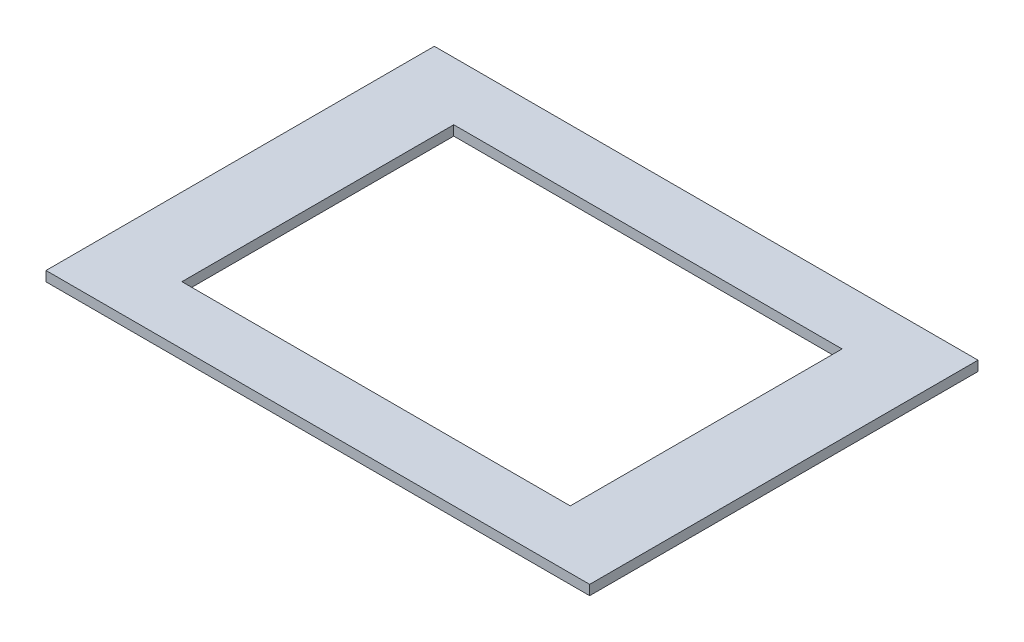
ISO-10303-21;
HEADER;
FILE_DESCRIPTION(('STEP AP214'),'2;1');
FILE_NAME('part.step','',(''),(''),'','','');
FILE_SCHEMA(('AUTOMOTIVE_DESIGN { 1 0 10303 214 1 1 1 1 }'));
ENDSEC;
DATA;
#1=APPLICATION_CONTEXT('core data for automotive mechanical design processes');
#2=APPLICATION_PROTOCOL_DEFINITION('international standard','automotive_design',2000,#1);
#3=PRODUCT_CONTEXT('',#1,'mechanical');
#4=PRODUCT('Part','Part','',(#3));
#5=PRODUCT_RELATED_PRODUCT_CATEGORY('part','',(#4));
#6=PRODUCT_DEFINITION_FORMATION('','',#4);
#7=PRODUCT_DEFINITION_CONTEXT('part definition',#1,'design');
#8=PRODUCT_DEFINITION('design','',#6,#7);
#9=PRODUCT_DEFINITION_SHAPE('','',#8);
#10=(LENGTH_UNIT() NAMED_UNIT(*) SI_UNIT(.MILLI.,.METRE.));
#11=(NAMED_UNIT(*) PLANE_ANGLE_UNIT() SI_UNIT($,.RADIAN.));
#12=(NAMED_UNIT(*) SI_UNIT($,.STERADIAN.) SOLID_ANGLE_UNIT());
#13=UNCERTAINTY_MEASURE_WITH_UNIT(LENGTH_MEASURE(1.E-05),#10,'distance_accuracy_value','');
#14=(GEOMETRIC_REPRESENTATION_CONTEXT(3) GLOBAL_UNCERTAINTY_ASSIGNED_CONTEXT((#13)) GLOBAL_UNIT_ASSIGNED_CONTEXT((#10,
#11,#12)) REPRESENTATION_CONTEXT('',''));
#15=CARTESIAN_POINT('',(0.,0.,0.));
#16=DIRECTION('',(0.,0.,1.));
#17=DIRECTION('',(1.,0.,0.));
#18=AXIS2_PLACEMENT_3D('',#15,#16,#17);
#19=CARTESIAN_POINT('',(0.,12.7,0.));
#20=DIRECTION('',(1.,0.,0.));
#21=DIRECTION('',(0.,0.,-1.));
#22=AXIS2_PLACEMENT_3D('',#19,#20,#21);
#23=PLANE('',#22);
#24=DIRECTION('',(0.,0.,1.));
#25=VECTOR('',#24,1.);
#26=CARTESIAN_POINT('',(0.,0.,0.));
#27=LINE('',#26,#25);
#28=CARTESIAN_POINT('',(0.,0.,-500.));
#29=VERTEX_POINT('',#28);
#30=CARTESIAN_POINT('',(0.,0.,0.));
#31=VERTEX_POINT('',#30);
#32=EDGE_CURVE('E129',#29,#31,#27,.T.);
#33=ORIENTED_EDGE('',*,*,#32,.T.);
#34=DIRECTION('',(0.,-1.,0.));
#35=VECTOR('',#34,1.);
#36=CARTESIAN_POINT('',(0.,12.7,0.));
#37=LINE('',#36,#35);
#38=CARTESIAN_POINT('',(0.,12.7,0.));
#39=VERTEX_POINT('',#38);
#40=EDGE_CURVE('E11',#39,#31,#37,.T.);
#41=ORIENTED_EDGE('',*,*,#40,.F.);
#42=DIRECTION('',(0.,0.,1.));
#43=VECTOR('',#42,1.);
#44=CARTESIAN_POINT('',(0.,12.7,0.));
#45=LINE('',#44,#43);
#46=CARTESIAN_POINT('',(0.,12.7,-500.));
#47=VERTEX_POINT('',#46);
#48=EDGE_CURVE('E133',#47,#39,#45,.T.);
#49=ORIENTED_EDGE('',*,*,#48,.F.);
#50=DIRECTION('',(0.,-1.,0.));
#51=VECTOR('',#50,1.);
#52=CARTESIAN_POINT('',(0.,12.7,-500.));
#53=LINE('',#52,#51);
#54=EDGE_CURVE('E143',#47,#29,#53,.T.);
#55=ORIENTED_EDGE('',*,*,#54,.T.);
#56=EDGE_LOOP('',(#33,#41,#49,#55));
#57=FACE_BOUND('',#56,.T.);
#58=ADVANCED_FACE('F32',(#57),#23,.F.);
#59=CARTESIAN_POINT('',(0.,12.7,0.));
#60=DIRECTION('',(0.,0.,-1.));
#61=DIRECTION('',(-1.,0.,0.));
#62=AXIS2_PLACEMENT_3D('',#59,#60,#61);
#63=PLANE('',#62);
#64=DIRECTION('',(1.,0.,0.));
#65=VECTOR('',#64,1.);
#66=CARTESIAN_POINT('',(0.,0.,0.));
#67=LINE('',#66,#65);
#68=CARTESIAN_POINT('',(700.,0.,0.));
#69=VERTEX_POINT('',#68);
#70=EDGE_CURVE('E146',#31,#69,#67,.T.);
#71=ORIENTED_EDGE('',*,*,#70,.T.);
#72=DIRECTION('',(0.,-1.,0.));
#73=VECTOR('',#72,1.);
#74=CARTESIAN_POINT('',(700.,12.7,0.));
#75=LINE('',#74,#73);
#76=CARTESIAN_POINT('',(700.,12.7,0.));
#77=VERTEX_POINT('',#76);
#78=EDGE_CURVE('E39',#77,#69,#75,.T.);
#79=ORIENTED_EDGE('',*,*,#78,.F.);
#80=DIRECTION('',(1.,0.,0.));
#81=VECTOR('',#80,1.);
#82=CARTESIAN_POINT('',(0.,12.7,0.));
#83=LINE('',#82,#81);
#84=EDGE_CURVE('E136',#39,#77,#83,.T.);
#85=ORIENTED_EDGE('',*,*,#84,.F.);
#86=ORIENTED_EDGE('',*,*,#40,.T.);
#87=EDGE_LOOP('',(#71,#79,#85,#86));
#88=FACE_BOUND('',#87,.T.);
#89=ADVANCED_FACE('F174',(#88),#63,.F.);
#90=CARTESIAN_POINT('',(700.,12.7,0.));
#91=DIRECTION('',(-1.,0.,0.));
#92=DIRECTION('',(0.,0.,1.));
#93=AXIS2_PLACEMENT_3D('',#90,#91,#92);
#94=PLANE('',#93);
#95=DIRECTION('',(0.,0.,-1.));
#96=VECTOR('',#95,1.);
#97=CARTESIAN_POINT('',(700.,0.,0.));
#98=LINE('',#97,#96);
#99=CARTESIAN_POINT('',(700.,0.,-500.));
#100=VERTEX_POINT('',#99);
#101=EDGE_CURVE('E148',#69,#100,#98,.T.);
#102=ORIENTED_EDGE('',*,*,#101,.T.);
#103=DIRECTION('',(0.,-1.,0.));
#104=VECTOR('',#103,1.);
#105=CARTESIAN_POINT('',(700.,12.7,-500.));
#106=LINE('',#105,#104);
#107=CARTESIAN_POINT('',(700.,12.7,-500.));
#108=VERTEX_POINT('',#107);
#109=EDGE_CURVE('E153',#108,#100,#106,.T.);
#110=ORIENTED_EDGE('',*,*,#109,.F.);
#111=DIRECTION('',(0.,0.,-1.));
#112=VECTOR('',#111,1.);
#113=CARTESIAN_POINT('',(700.,12.7,0.));
#114=LINE('',#113,#112);
#115=EDGE_CURVE('E139',#77,#108,#114,.T.);
#116=ORIENTED_EDGE('',*,*,#115,.F.);
#117=ORIENTED_EDGE('',*,*,#78,.T.);
#118=EDGE_LOOP('',(#102,#110,#116,#117));
#119=FACE_BOUND('',#118,.T.);
#120=ADVANCED_FACE('F160',(#119),#94,.F.);
#121=CARTESIAN_POINT('',(0.,12.7,-500.));
#122=DIRECTION('',(0.,0.,1.));
#123=DIRECTION('',(1.,0.,0.));
#124=AXIS2_PLACEMENT_3D('',#121,#122,#123);
#125=PLANE('',#124);
#126=DIRECTION('',(-1.,0.,0.));
#127=VECTOR('',#126,1.);
#128=CARTESIAN_POINT('',(0.,0.,-500.));
#129=LINE('',#128,#127);
#130=EDGE_CURVE('E137',#100,#29,#129,.T.);
#131=ORIENTED_EDGE('',*,*,#130,.T.);
#132=ORIENTED_EDGE('',*,*,#54,.F.);
#133=DIRECTION('',(-1.,0.,0.));
#134=VECTOR('',#133,1.);
#135=CARTESIAN_POINT('',(0.,12.7,-500.));
#136=LINE('',#135,#134);
#137=EDGE_CURVE('E141',#108,#47,#136,.T.);
#138=ORIENTED_EDGE('',*,*,#137,.F.);
#139=ORIENTED_EDGE('',*,*,#109,.T.);
#140=EDGE_LOOP('',(#131,#132,#138,#139));
#141=FACE_BOUND('',#140,.T.);
#142=ADVANCED_FACE('F167',(#141),#125,.F.);
#143=CARTESIAN_POINT('',(0.,12.7,0.));
#144=DIRECTION('',(0.,-1.,0.));
#145=DIRECTION('',(0.,0.,-1.));
#146=AXIS2_PLACEMENT_3D('',#143,#144,#145);
#147=PLANE('',#146);
#148=DIRECTION('',(1.,0.,0.));
#149=VECTOR('',#148,1.);
#150=CARTESIAN_POINT('',(100.,12.7,-75.));
#151=LINE('',#150,#149);
#152=CARTESIAN_POINT('',(100.,12.7,-75.));
#153=VERTEX_POINT('',#152);
#154=CARTESIAN_POINT('',(600.,12.7,-75.));
#155=VERTEX_POINT('',#154);
#156=EDGE_CURVE('E123',#153,#155,#151,.T.);
#157=ORIENTED_EDGE('',*,*,#156,.F.);
#158=DIRECTION('',(0.,0.,1.));
#159=VECTOR('',#158,1.);
#160=CARTESIAN_POINT('',(100.,12.7,-425.));
#161=LINE('',#160,#159);
#162=CARTESIAN_POINT('',(100.,12.7,-425.));
#163=VERTEX_POINT('',#162);
#164=EDGE_CURVE('E46',#163,#153,#161,.T.);
#165=ORIENTED_EDGE('',*,*,#164,.F.);
#166=DIRECTION('',(-1.,0.,0.));
#167=VECTOR('',#166,1.);
#168=CARTESIAN_POINT('',(100.,12.7,-425.));
#169=LINE('',#168,#167);
#170=CARTESIAN_POINT('',(600.,12.7,-425.));
#171=VERTEX_POINT('',#170);
#172=EDGE_CURVE('E114',#171,#163,#169,.T.);
#173=ORIENTED_EDGE('',*,*,#172,.F.);
#174=DIRECTION('',(0.,0.,-1.));
#175=VECTOR('',#174,1.);
#176=CARTESIAN_POINT('',(600.,12.7,-425.));
#177=LINE('',#176,#175);
#178=EDGE_CURVE('E117',#155,#171,#177,.T.);
#179=ORIENTED_EDGE('',*,*,#178,.F.);
#180=EDGE_LOOP('',(#157,#165,#173,#179));
#181=FACE_BOUND('',#180,.T.);
#182=ORIENTED_EDGE('',*,*,#48,.T.);
#183=ORIENTED_EDGE('',*,*,#84,.T.);
#184=ORIENTED_EDGE('',*,*,#115,.T.);
#185=ORIENTED_EDGE('',*,*,#137,.T.);
#186=EDGE_LOOP('',(#182,#183,#184,#185));
#187=FACE_BOUND('',#186,.T.);
#188=ADVANCED_FACE('F173',(#181,#187),#147,.F.);
#189=CARTESIAN_POINT('',(0.,0.,0.));
#190=DIRECTION('',(0.,-1.,0.));
#191=DIRECTION('',(0.,0.,-1.));
#192=AXIS2_PLACEMENT_3D('',#189,#190,#191);
#193=PLANE('',#192);
#194=DIRECTION('',(0.,0.,1.));
#195=VECTOR('',#194,1.);
#196=CARTESIAN_POINT('',(100.,0.,-425.));
#197=LINE('',#196,#195);
#198=CARTESIAN_POINT('',(100.,0.,-425.));
#199=VERTEX_POINT('',#198);
#200=CARTESIAN_POINT('',(100.,0.,-75.));
#201=VERTEX_POINT('',#200);
#202=EDGE_CURVE('E98',#199,#201,#197,.T.);
#203=ORIENTED_EDGE('',*,*,#202,.T.);
#204=DIRECTION('',(1.,0.,0.));
#205=VECTOR('',#204,1.);
#206=CARTESIAN_POINT('',(100.,0.,-75.));
#207=LINE('',#206,#205);
#208=CARTESIAN_POINT('',(600.,0.,-75.));
#209=VERTEX_POINT('',#208);
#210=EDGE_CURVE('E107',#201,#209,#207,.T.);
#211=ORIENTED_EDGE('',*,*,#210,.T.);
#212=DIRECTION('',(0.,0.,-1.));
#213=VECTOR('',#212,1.);
#214=CARTESIAN_POINT('',(600.,0.,-425.));
#215=LINE('',#214,#213);
#216=CARTESIAN_POINT('',(600.,0.,-425.));
#217=VERTEX_POINT('',#216);
#218=EDGE_CURVE('E54',#209,#217,#215,.T.);
#219=ORIENTED_EDGE('',*,*,#218,.T.);
#220=DIRECTION('',(-1.,0.,0.));
#221=VECTOR('',#220,1.);
#222=CARTESIAN_POINT('',(100.,0.,-425.));
#223=LINE('',#222,#221);
#224=EDGE_CURVE('E104',#217,#199,#223,.T.);
#225=ORIENTED_EDGE('',*,*,#224,.T.);
#226=EDGE_LOOP('',(#203,#211,#219,#225));
#227=FACE_BOUND('',#226,.T.);
#228=ORIENTED_EDGE('',*,*,#32,.F.);
#229=ORIENTED_EDGE('',*,*,#130,.F.);
#230=ORIENTED_EDGE('',*,*,#101,.F.);
#231=ORIENTED_EDGE('',*,*,#70,.F.);
#232=EDGE_LOOP('',(#228,#229,#230,#231));
#233=FACE_BOUND('',#232,.T.);
#234=ADVANCED_FACE('F111',(#227,#233),#193,.T.);
#235=CARTESIAN_POINT('',(100.,0.,-425.));
#236=DIRECTION('',(-1.,0.,0.));
#237=DIRECTION('',(0.,0.,1.));
#238=AXIS2_PLACEMENT_3D('',#235,#236,#237);
#239=PLANE('',#238);
#240=ORIENTED_EDGE('',*,*,#164,.T.);
#241=DIRECTION('',(0.,1.,0.));
#242=VECTOR('',#241,1.);
#243=CARTESIAN_POINT('',(100.,0.,-75.));
#244=LINE('',#243,#242);
#245=EDGE_CURVE('E94',#201,#153,#244,.T.);
#246=ORIENTED_EDGE('',*,*,#245,.F.);
#247=ORIENTED_EDGE('',*,*,#202,.F.);
#248=DIRECTION('',(0.,1.,0.));
#249=VECTOR('',#248,1.);
#250=CARTESIAN_POINT('',(100.,0.,-425.));
#251=LINE('',#250,#249);
#252=EDGE_CURVE('E127',#199,#163,#251,.T.);
#253=ORIENTED_EDGE('',*,*,#252,.T.);
#254=EDGE_LOOP('',(#240,#246,#247,#253));
#255=FACE_BOUND('',#254,.T.);
#256=ADVANCED_FACE('F96',(#255),#239,.F.);
#257=CARTESIAN_POINT('',(100.,0.,-425.));
#258=DIRECTION('',(0.,0.,-1.));
#259=DIRECTION('',(-1.,0.,0.));
#260=AXIS2_PLACEMENT_3D('',#257,#258,#259);
#261=PLANE('',#260);
#262=ORIENTED_EDGE('',*,*,#172,.T.);
#263=ORIENTED_EDGE('',*,*,#252,.F.);
#264=ORIENTED_EDGE('',*,*,#224,.F.);
#265=DIRECTION('',(0.,1.,0.));
#266=VECTOR('',#265,1.);
#267=CARTESIAN_POINT('',(600.,0.,-425.));
#268=LINE('',#267,#266);
#269=EDGE_CURVE('E130',#217,#171,#268,.T.);
#270=ORIENTED_EDGE('',*,*,#269,.T.);
#271=EDGE_LOOP('',(#262,#263,#264,#270));
#272=FACE_BOUND('',#271,.T.);
#273=ADVANCED_FACE('F191',(#272),#261,.F.);
#274=CARTESIAN_POINT('',(600.,0.,-425.));
#275=DIRECTION('',(1.,0.,0.));
#276=DIRECTION('',(0.,0.,-1.));
#277=AXIS2_PLACEMENT_3D('',#274,#275,#276);
#278=PLANE('',#277);
#279=ORIENTED_EDGE('',*,*,#178,.T.);
#280=ORIENTED_EDGE('',*,*,#269,.F.);
#281=ORIENTED_EDGE('',*,*,#218,.F.);
#282=DIRECTION('',(0.,1.,0.));
#283=VECTOR('',#282,1.);
#284=CARTESIAN_POINT('',(600.,0.,-75.));
#285=LINE('',#284,#283);
#286=EDGE_CURVE('E103',#209,#155,#285,.T.);
#287=ORIENTED_EDGE('',*,*,#286,.T.);
#288=EDGE_LOOP('',(#279,#280,#281,#287));
#289=FACE_BOUND('',#288,.T.);
#290=ADVANCED_FACE('F194',(#289),#278,.F.);
#291=CARTESIAN_POINT('',(100.,0.,-75.));
#292=DIRECTION('',(0.,0.,1.));
#293=DIRECTION('',(1.,0.,0.));
#294=AXIS2_PLACEMENT_3D('',#291,#292,#293);
#295=PLANE('',#294);
#296=ORIENTED_EDGE('',*,*,#156,.T.);
#297=ORIENTED_EDGE('',*,*,#286,.F.);
#298=ORIENTED_EDGE('',*,*,#210,.F.);
#299=ORIENTED_EDGE('',*,*,#245,.T.);
#300=EDGE_LOOP('',(#296,#297,#298,#299));
#301=FACE_BOUND('',#300,.T.);
#302=ADVANCED_FACE('F108',(#301),#295,.F.);
#303=CLOSED_SHELL('',(#58,#89,#120,#142,#188,#234,#256,#273,#290,#302));
#304=MANIFOLD_SOLID_BREP('B2',#303);
#305=ADVANCED_BREP_SHAPE_REPRESENTATION('',(#18,#304),#14);
#306=SHAPE_DEFINITION_REPRESENTATION(#9,#305);
ENDSEC;
END-ISO-10303-21;
